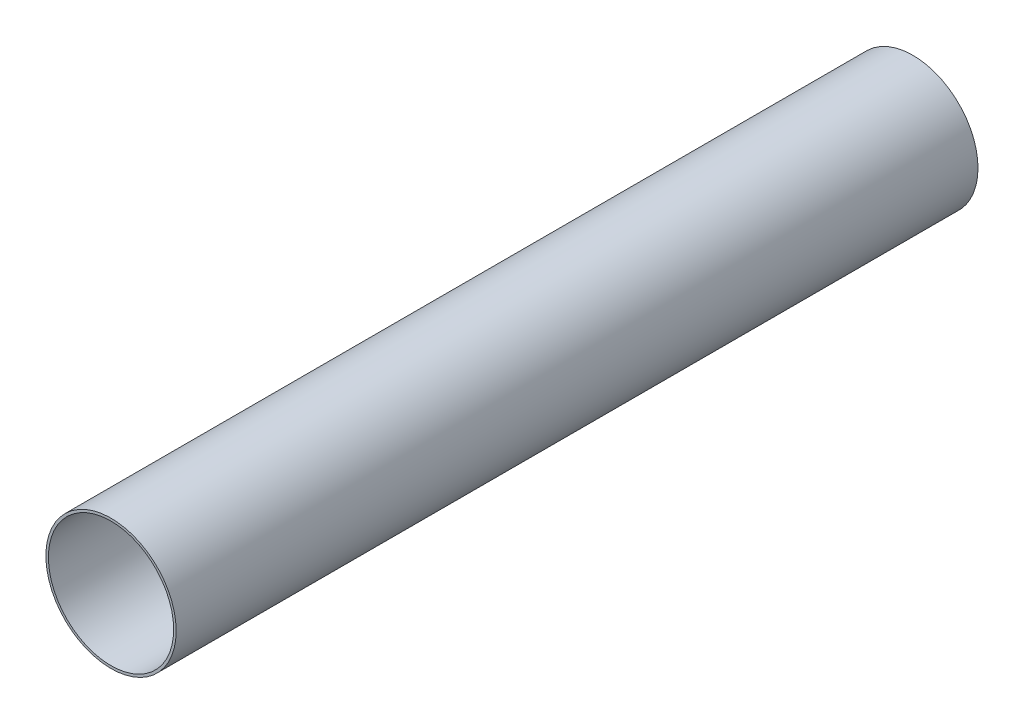
ISO-10303-21;
HEADER;
FILE_DESCRIPTION(('STEP AP214'),'2;1');
FILE_NAME('part.step','',(''),(''),'','','');
FILE_SCHEMA(('AUTOMOTIVE_DESIGN { 1 0 10303 214 1 1 1 1 }'));
ENDSEC;
DATA;
#1=APPLICATION_CONTEXT('core data for automotive mechanical design processes');
#2=APPLICATION_PROTOCOL_DEFINITION('international standard','automotive_design',2000,#1);
#3=PRODUCT_CONTEXT('',#1,'mechanical');
#4=PRODUCT('Part','Part','',(#3));
#5=PRODUCT_RELATED_PRODUCT_CATEGORY('part','',(#4));
#6=PRODUCT_DEFINITION_FORMATION('','',#4);
#7=PRODUCT_DEFINITION_CONTEXT('part definition',#1,'design');
#8=PRODUCT_DEFINITION('design','',#6,#7);
#9=PRODUCT_DEFINITION_SHAPE('','',#8);
#10=(LENGTH_UNIT() NAMED_UNIT(*) SI_UNIT(.MILLI.,.METRE.));
#11=(NAMED_UNIT(*) PLANE_ANGLE_UNIT() SI_UNIT($,.RADIAN.));
#12=(NAMED_UNIT(*) SI_UNIT($,.STERADIAN.) SOLID_ANGLE_UNIT());
#13=UNCERTAINTY_MEASURE_WITH_UNIT(LENGTH_MEASURE(1.E-05),#10,'distance_accuracy_value','');
#14=(GEOMETRIC_REPRESENTATION_CONTEXT(3) GLOBAL_UNCERTAINTY_ASSIGNED_CONTEXT((#13)) GLOBAL_UNIT_ASSIGNED_CONTEXT((#10,
#11,#12)) REPRESENTATION_CONTEXT('',''));
#15=CARTESIAN_POINT('',(0.,0.,0.));
#16=DIRECTION('',(0.,0.,1.));
#17=DIRECTION('',(1.,0.,0.));
#18=AXIS2_PLACEMENT_3D('',#15,#16,#17);
#19=CARTESIAN_POINT('',(0.,0.,160.));
#20=DIRECTION('',(0.,0.,1.));
#21=DIRECTION('',(1.,0.,0.));
#22=AXIS2_PLACEMENT_3D('',#19,#20,#21);
#23=PLANE('',#22);
#24=CARTESIAN_POINT('',(0.,0.,160.));
#25=DIRECTION('',(0.,0.,1.));
#26=DIRECTION('',(1.,0.,0.));
#27=AXIS2_PLACEMENT_3D('',#24,#25,#26);
#28=CIRCLE('',#27,13.);
#29=CARTESIAN_POINT('',(13.,0.,160.));
#30=VERTEX_POINT('',#29);
#31=EDGE_CURVE('E10',#30,#30,#28,.T.);
#32=ORIENTED_EDGE('',*,*,#31,.T.);
#33=EDGE_LOOP('',(#32));
#34=FACE_BOUND('',#33,.T.);
#35=CARTESIAN_POINT('',(0.,0.,160.));
#36=DIRECTION('',(0.,0.,1.));
#37=DIRECTION('',(1.,0.,0.));
#38=AXIS2_PLACEMENT_3D('',#35,#36,#37);
#39=CIRCLE('',#38,12.5);
#40=CARTESIAN_POINT('',(12.5,0.,160.));
#41=VERTEX_POINT('',#40);
#42=EDGE_CURVE('E50',#41,#41,#39,.T.);
#43=ORIENTED_EDGE('',*,*,#42,.F.);
#44=EDGE_LOOP('',(#43));
#45=FACE_BOUND('',#44,.T.);
#46=ADVANCED_FACE('F37',(#34,#45),#23,.T.);
#47=CARTESIAN_POINT('',(0.,0.,0.));
#48=DIRECTION('',(0.,0.,1.));
#49=DIRECTION('',(1.,0.,0.));
#50=AXIS2_PLACEMENT_3D('',#47,#48,#49);
#51=PLANE('',#50);
#52=CARTESIAN_POINT('',(0.,0.,0.));
#53=DIRECTION('',(0.,0.,1.));
#54=DIRECTION('',(1.,0.,0.));
#55=AXIS2_PLACEMENT_3D('',#52,#53,#54);
#56=CIRCLE('',#55,13.);
#57=CARTESIAN_POINT('',(13.,0.,0.));
#58=VERTEX_POINT('',#57);
#59=EDGE_CURVE('E41',#58,#58,#56,.T.);
#60=ORIENTED_EDGE('',*,*,#59,.F.);
#61=EDGE_LOOP('',(#60));
#62=FACE_BOUND('',#61,.T.);
#63=CARTESIAN_POINT('',(0.,0.,0.));
#64=DIRECTION('',(0.,0.,1.));
#65=DIRECTION('',(1.,0.,0.));
#66=AXIS2_PLACEMENT_3D('',#63,#64,#65);
#67=CIRCLE('',#66,12.5);
#68=CARTESIAN_POINT('',(12.5,0.,0.));
#69=VERTEX_POINT('',#68);
#70=EDGE_CURVE('E52',#69,#69,#67,.T.);
#71=ORIENTED_EDGE('',*,*,#70,.T.);
#72=EDGE_LOOP('',(#71));
#73=FACE_BOUND('',#72,.T.);
#74=ADVANCED_FACE('F64',(#62,#73),#51,.F.);
#75=CARTESIAN_POINT('',(0.,0.,160.));
#76=DIRECTION('',(0.,0.,-1.));
#77=DIRECTION('',(-1.,0.,0.));
#78=AXIS2_PLACEMENT_3D('',#75,#76,#77);
#79=CYLINDRICAL_SURFACE('',#78,13.);
#80=ORIENTED_EDGE('',*,*,#31,.F.);
#81=EDGE_LOOP('',(#80));
#82=FACE_BOUND('',#81,.T.);
#83=ORIENTED_EDGE('',*,*,#59,.T.);
#84=EDGE_LOOP('',(#83));
#85=FACE_BOUND('',#84,.T.);
#86=ADVANCED_FACE('F39',(#82,#85),#79,.T.);
#87=CARTESIAN_POINT('',(0.,0.,160.));
#88=DIRECTION('',(0.,0.,-1.));
#89=DIRECTION('',(-1.,0.,0.));
#90=AXIS2_PLACEMENT_3D('',#87,#88,#89);
#91=CYLINDRICAL_SURFACE('',#90,12.5);
#92=ORIENTED_EDGE('',*,*,#42,.T.);
#93=EDGE_LOOP('',(#92));
#94=FACE_BOUND('',#93,.T.);
#95=ORIENTED_EDGE('',*,*,#70,.F.);
#96=EDGE_LOOP('',(#95));
#97=FACE_BOUND('',#96,.T.);
#98=ADVANCED_FACE('F60',(#94,#97),#91,.F.);
#99=CLOSED_SHELL('',(#46,#74,#86,#98));
#100=MANIFOLD_SOLID_BREP('B2',#99);
#101=ADVANCED_BREP_SHAPE_REPRESENTATION('',(#18,#100),#14);
#102=SHAPE_DEFINITION_REPRESENTATION(#9,#101);
ENDSEC;
END-ISO-10303-21;
